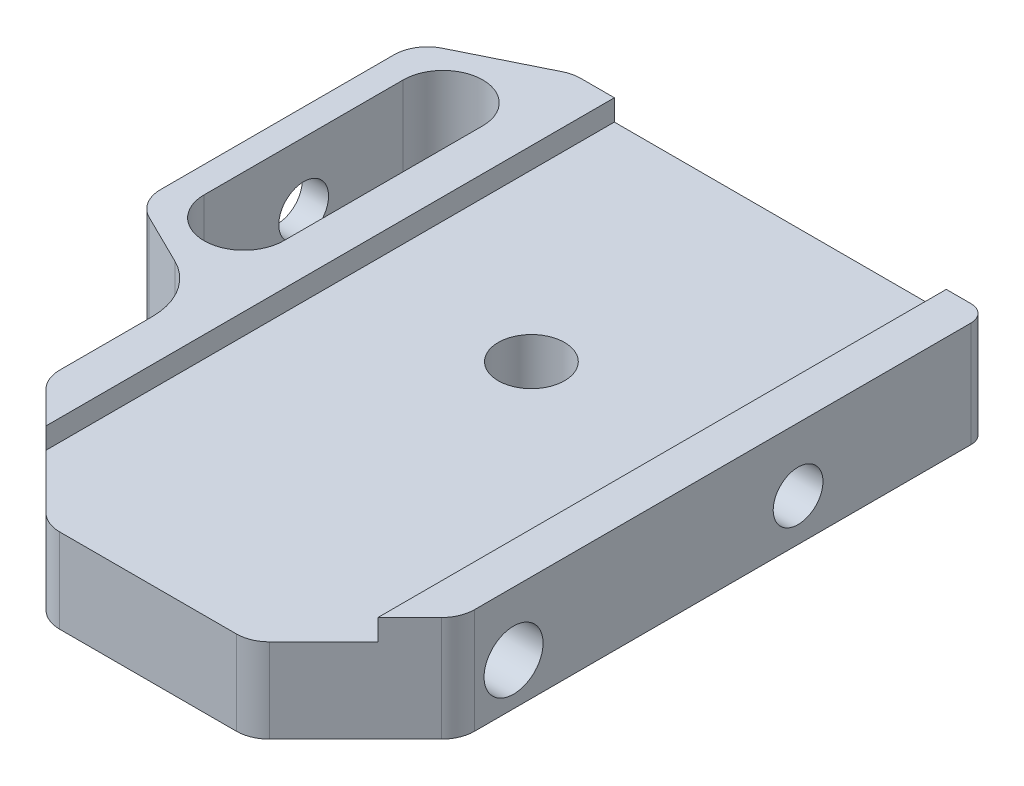
ISO-10303-21;
HEADER;
FILE_DESCRIPTION(('STEP AP214'),'2;1');
FILE_NAME('part.step','',(''),(''),'','','');
FILE_SCHEMA(('AUTOMOTIVE_DESIGN { 1 0 10303 214 1 1 1 1 }'));
ENDSEC;
DATA;
#1=APPLICATION_CONTEXT('core data for automotive mechanical design processes');
#2=APPLICATION_PROTOCOL_DEFINITION('international standard','automotive_design',2000,#1);
#3=PRODUCT_CONTEXT('',#1,'mechanical');
#4=PRODUCT('Part','Part','',(#3));
#5=PRODUCT_RELATED_PRODUCT_CATEGORY('part','',(#4));
#6=PRODUCT_DEFINITION_FORMATION('','',#4);
#7=PRODUCT_DEFINITION_CONTEXT('part definition',#1,'design');
#8=PRODUCT_DEFINITION('design','',#6,#7);
#9=PRODUCT_DEFINITION_SHAPE('','',#8);
#10=(LENGTH_UNIT() NAMED_UNIT(*) SI_UNIT(.MILLI.,.METRE.));
#11=(NAMED_UNIT(*) PLANE_ANGLE_UNIT() SI_UNIT($,.RADIAN.));
#12=(NAMED_UNIT(*) SI_UNIT($,.STERADIAN.) SOLID_ANGLE_UNIT());
#13=UNCERTAINTY_MEASURE_WITH_UNIT(LENGTH_MEASURE(1.E-05),#10,'distance_accuracy_value','');
#14=(GEOMETRIC_REPRESENTATION_CONTEXT(3) GLOBAL_UNCERTAINTY_ASSIGNED_CONTEXT((#13)) GLOBAL_UNIT_ASSIGNED_CONTEXT((#10,
#11,#12)) REPRESENTATION_CONTEXT('',''));
#15=CARTESIAN_POINT('',(0.,0.,0.));
#16=DIRECTION('',(0.,0.,1.));
#17=DIRECTION('',(1.,0.,0.));
#18=AXIS2_PLACEMENT_3D('',#15,#16,#17);
#19=CARTESIAN_POINT('',(22.5,0.,38.1));
#20=DIRECTION('',(1.,0.,0.));
#21=DIRECTION('',(0.,0.,-1.));
#22=AXIS2_PLACEMENT_3D('',#19,#20,#21);
#23=PLANE('',#22);
#24=DIRECTION('',(0.,1.,0.));
#25=VECTOR('',#24,1.);
#26=CARTESIAN_POINT('',(22.5,0.,34.25));
#27=LINE('',#26,#25);
#28=CARTESIAN_POINT('',(22.5,6.35,34.25));
#29=VERTEX_POINT('',#28);
#30=CARTESIAN_POINT('',(22.5,5.08,34.25));
#31=VERTEX_POINT('',#30);
#32=EDGE_CURVE('E398',#29,#31,#27,.F.);
#33=ORIENTED_EDGE('',*,*,#32,.F.);
#34=DIRECTION('',(0.,0.,1.));
#35=VECTOR('',#34,1.);
#36=CARTESIAN_POINT('',(22.5,6.35,38.1));
#37=LINE('',#36,#35);
#38=CARTESIAN_POINT('',(22.5,6.35,0.));
#39=VERTEX_POINT('',#38);
#40=EDGE_CURVE('E288',#39,#29,#37,.T.);
#41=ORIENTED_EDGE('',*,*,#40,.F.);
#42=DIRECTION('',(0.,1.,0.));
#43=VECTOR('',#42,1.);
#44=CARTESIAN_POINT('',(22.5,0.,0.));
#45=LINE('',#44,#43);
#46=CARTESIAN_POINT('',(22.5,5.08,0.));
#47=VERTEX_POINT('',#46);
#48=EDGE_CURVE('E417',#47,#39,#45,.T.);
#49=ORIENTED_EDGE('',*,*,#48,.F.);
#50=DIRECTION('',(0.,0.,1.));
#51=VECTOR('',#50,1.);
#52=CARTESIAN_POINT('',(22.5,5.08,38.1));
#53=LINE('',#52,#51);
#54=EDGE_CURVE('E268',#31,#47,#53,.F.);
#55=ORIENTED_EDGE('',*,*,#54,.F.);
#56=EDGE_LOOP('',(#33,#41,#49,#55));
#57=FACE_BOUND('',#56,.T.);
#58=ADVANCED_FACE('F20',(#57),#23,.F.);
#59=CARTESIAN_POINT('',(2.5,0.,38.1));
#60=DIRECTION('',(1.,0.,0.));
#61=DIRECTION('',(0.,0.,-1.));
#62=AXIS2_PLACEMENT_3D('',#59,#60,#61);
#63=PLANE('',#62);
#64=DIRECTION('',(0.,0.,1.));
#65=VECTOR('',#64,1.);
#66=CARTESIAN_POINT('',(2.5,5.08,38.1));
#67=LINE('',#66,#65);
#68=CARTESIAN_POINT('',(2.5,5.08,0.));
#69=VERTEX_POINT('',#68);
#70=CARTESIAN_POINT('',(2.5,5.08,34.25));
#71=VERTEX_POINT('',#70);
#72=EDGE_CURVE('E263',#69,#71,#67,.T.);
#73=ORIENTED_EDGE('',*,*,#72,.F.);
#74=DIRECTION('',(0.,1.,0.));
#75=VECTOR('',#74,1.);
#76=CARTESIAN_POINT('',(2.5,0.,0.));
#77=LINE('',#76,#75);
#78=CARTESIAN_POINT('',(2.5,6.35,0.));
#79=VERTEX_POINT('',#78);
#80=EDGE_CURVE('E187',#69,#79,#77,.T.);
#81=ORIENTED_EDGE('',*,*,#80,.T.);
#82=DIRECTION('',(0.,0.,1.));
#83=VECTOR('',#82,1.);
#84=CARTESIAN_POINT('',(2.5,6.35,38.1));
#85=LINE('',#84,#83);
#86=CARTESIAN_POINT('',(2.5,6.35,34.25));
#87=VERTEX_POINT('',#86);
#88=EDGE_CURVE('E254',#87,#79,#85,.F.);
#89=ORIENTED_EDGE('',*,*,#88,.F.);
#90=DIRECTION('',(0.,1.,0.));
#91=VECTOR('',#90,1.);
#92=CARTESIAN_POINT('',(2.5,0.,34.25));
#93=LINE('',#92,#91);
#94=EDGE_CURVE('E394',#87,#71,#93,.F.);
#95=ORIENTED_EDGE('',*,*,#94,.T.);
#96=EDGE_LOOP('',(#73,#81,#89,#95));
#97=FACE_BOUND('',#96,.T.);
#98=ADVANCED_FACE('F640',(#97),#63,.T.);
#99=CARTESIAN_POINT('',(2.000000064,0.,30.9215728487441));
#100=DIRECTION('',(0.,-1.,0.));
#101=DIRECTION('',(0.,0.,-1.));
#102=AXIS2_PLACEMENT_3D('',#99,#100,#101);
#103=CYLINDRICAL_SURFACE('',#102,2.000000064);
#104=CARTESIAN_POINT('',(2.000000064,6.35,30.9215728487441));
#105=DIRECTION('',(0.,-1.,0.));
#106=DIRECTION('',(0.,0.,-1.));
#107=AXIS2_PLACEMENT_3D('',#104,#105,#106);
#108=CIRCLE('',#107,2.000000064);
#109=CARTESIAN_POINT('',(0.,6.35,30.9215728487441));
#110=VERTEX_POINT('',#109);
#111=CARTESIAN_POINT('',(0.585786456372072,6.35,32.3357864563721));
#112=VERTEX_POINT('',#111);
#113=EDGE_CURVE('E257',#110,#112,#108,.F.);
#114=ORIENTED_EDGE('',*,*,#113,.F.);
#115=DIRECTION('',(0.,1.,0.));
#116=VECTOR('',#115,1.);
#117=CARTESIAN_POINT('',(0.,0.,30.9215728487441));
#118=LINE('',#117,#116);
#119=CARTESIAN_POINT('',(0.,0.,30.9215728487441));
#120=VERTEX_POINT('',#119);
#121=EDGE_CURVE('E183',#120,#110,#118,.T.);
#122=ORIENTED_EDGE('',*,*,#121,.F.);
#123=CARTESIAN_POINT('',(2.000000064,0.,30.9215728487441));
#124=DIRECTION('',(0.,-1.,0.));
#125=DIRECTION('',(0.,0.,-1.));
#126=AXIS2_PLACEMENT_3D('',#123,#124,#125);
#127=CIRCLE('',#126,2.000000064);
#128=CARTESIAN_POINT('',(0.585786456372071,0.,32.3357864563721));
#129=VERTEX_POINT('',#128);
#130=EDGE_CURVE('E23',#120,#129,#127,.F.);
#131=ORIENTED_EDGE('',*,*,#130,.T.);
#132=DIRECTION('',(0.,1.,0.));
#133=VECTOR('',#132,1.);
#134=CARTESIAN_POINT('',(0.585786456372072,0.,32.3357864563721));
#135=LINE('',#134,#133);
#136=EDGE_CURVE('E182',#129,#112,#135,.T.);
#137=ORIENTED_EDGE('',*,*,#136,.T.);
#138=EDGE_LOOP('',(#114,#122,#131,#137));
#139=FACE_BOUND('',#138,.T.);
#140=ADVANCED_FACE('F181',(#139),#103,.T.);
#141=CARTESIAN_POINT('',(7.17842715125588,0.,36.099999936));
#142=DIRECTION('',(0.,1.,0.));
#143=DIRECTION('',(0.,0.,1.));
#144=AXIS2_PLACEMENT_3D('',#141,#142,#143);
#145=CYLINDRICAL_SURFACE('',#144,2.000000064);
#146=CARTESIAN_POINT('',(7.17842715125588,0.,36.099999936));
#147=DIRECTION('',(0.,1.,0.));
#148=DIRECTION('',(0.,0.,1.));
#149=AXIS2_PLACEMENT_3D('',#146,#147,#148);
#150=CIRCLE('',#149,2.000000064);
#151=CARTESIAN_POINT('',(5.76421354362795,0.,37.5142135436279));
#152=VERTEX_POINT('',#151);
#153=CARTESIAN_POINT('',(7.17842715125588,0.,38.1));
#154=VERTEX_POINT('',#153);
#155=EDGE_CURVE('E186',#152,#154,#150,.T.);
#156=ORIENTED_EDGE('',*,*,#155,.T.);
#157=DIRECTION('',(0.,1.,0.));
#158=VECTOR('',#157,1.);
#159=CARTESIAN_POINT('',(7.17842715125588,0.,38.1));
#160=LINE('',#159,#158);
#161=CARTESIAN_POINT('',(7.17842715125588,5.08,38.1));
#162=VERTEX_POINT('',#161);
#163=EDGE_CURVE('E486',#162,#154,#160,.F.);
#164=ORIENTED_EDGE('',*,*,#163,.F.);
#165=CARTESIAN_POINT('',(7.17842715125588,5.08,36.099999936));
#166=DIRECTION('',(0.,1.,0.));
#167=DIRECTION('',(0.,0.,1.));
#168=AXIS2_PLACEMENT_3D('',#165,#166,#167);
#169=CIRCLE('',#168,2.000000064);
#170=CARTESIAN_POINT('',(5.76421354362795,5.08,37.5142135436279));
#171=VERTEX_POINT('',#170);
#172=EDGE_CURVE('E260',#171,#162,#169,.T.);
#173=ORIENTED_EDGE('',*,*,#172,.F.);
#174=DIRECTION('',(0.,1.,0.));
#175=VECTOR('',#174,1.);
#176=CARTESIAN_POINT('',(5.76421354362795,0.,37.5142135436279));
#177=LINE('',#176,#175);
#178=EDGE_CURVE('E493',#171,#152,#177,.F.);
#179=ORIENTED_EDGE('',*,*,#178,.T.);
#180=EDGE_LOOP('',(#156,#164,#173,#179));
#181=FACE_BOUND('',#180,.T.);
#182=ADVANCED_FACE('F630',(#181),#145,.T.);
#183=CARTESIAN_POINT('',(17.8215728487441,0.,36.099999936));
#184=DIRECTION('',(0.,1.,0.));
#185=DIRECTION('',(0.,0.,1.));
#186=AXIS2_PLACEMENT_3D('',#183,#184,#185);
#187=CYLINDRICAL_SURFACE('',#186,2.000000064);
#188=CARTESIAN_POINT('',(17.8215728487441,5.08,36.099999936));
#189=DIRECTION('',(0.,1.,0.));
#190=DIRECTION('',(0.,0.,1.));
#191=AXIS2_PLACEMENT_3D('',#188,#189,#190);
#192=CIRCLE('',#191,2.000000064);
#193=CARTESIAN_POINT('',(17.8215728487441,5.08,38.1));
#194=VERTEX_POINT('',#193);
#195=CARTESIAN_POINT('',(19.2357864563721,5.08,37.5142135436279));
#196=VERTEX_POINT('',#195);
#197=EDGE_CURVE('E264',#194,#196,#192,.T.);
#198=ORIENTED_EDGE('',*,*,#197,.F.);
#199=DIRECTION('',(0.,1.,0.));
#200=VECTOR('',#199,1.);
#201=CARTESIAN_POINT('',(17.8215728487441,0.,38.1));
#202=LINE('',#201,#200);
#203=CARTESIAN_POINT('',(17.8215728487441,0.,38.1));
#204=VERTEX_POINT('',#203);
#205=EDGE_CURVE('E491',#204,#194,#202,.T.);
#206=ORIENTED_EDGE('',*,*,#205,.F.);
#207=CARTESIAN_POINT('',(17.8215728487441,0.,36.099999936));
#208=DIRECTION('',(0.,1.,0.));
#209=DIRECTION('',(0.,0.,1.));
#210=AXIS2_PLACEMENT_3D('',#207,#208,#209);
#211=CIRCLE('',#210,2.000000064);
#212=CARTESIAN_POINT('',(19.2357864563721,0.,37.5142135436279));
#213=VERTEX_POINT('',#212);
#214=EDGE_CURVE('E277',#204,#213,#211,.T.);
#215=ORIENTED_EDGE('',*,*,#214,.T.);
#216=DIRECTION('',(0.,1.,0.));
#217=VECTOR('',#216,1.);
#218=CARTESIAN_POINT('',(19.2357864563721,0.,37.5142135436279));
#219=LINE('',#218,#217);
#220=EDGE_CURVE('E478',#196,#213,#219,.F.);
#221=ORIENTED_EDGE('',*,*,#220,.F.);
#222=EDGE_LOOP('',(#198,#206,#215,#221));
#223=FACE_BOUND('',#222,.T.);
#224=ADVANCED_FACE('F625',(#223),#187,.T.);
#225=CARTESIAN_POINT('',(35.56,2.54,28.575));
#226=DIRECTION('',(-1.,0.,0.));
#227=DIRECTION('',(0.,0.,1.));
#228=AXIS2_PLACEMENT_3D('',#225,#226,#227);
#229=CYLINDRICAL_SURFACE('',#228,1.778);
#230=CARTESIAN_POINT('',(25.,2.54,28.575));
#231=DIRECTION('',(-1.,0.,0.));
#232=DIRECTION('',(0.,0.,1.));
#233=AXIS2_PLACEMENT_3D('',#230,#231,#232);
#234=CIRCLE('',#233,1.778);
#235=CARTESIAN_POINT('',(25.,2.54,30.353));
#236=VERTEX_POINT('',#235);
#237=EDGE_CURVE('E321',#236,#236,#234,.F.);
#238=ORIENTED_EDGE('',*,*,#237,.T.);
#239=EDGE_LOOP('',(#238));
#240=FACE_BOUND('',#239,.T.);
#241=CARTESIAN_POINT('',(0.,2.54,28.575));
#242=DIRECTION('',(-1.,0.,0.));
#243=DIRECTION('',(0.,0.,1.));
#244=AXIS2_PLACEMENT_3D('',#241,#242,#243);
#245=CIRCLE('',#244,1.778);
#246=CARTESIAN_POINT('',(0.,2.54,30.353));
#247=VERTEX_POINT('',#246);
#248=EDGE_CURVE('E326',#247,#247,#245,.F.);
#249=ORIENTED_EDGE('',*,*,#248,.F.);
#250=EDGE_LOOP('',(#249));
#251=FACE_BOUND('',#250,.T.);
#252=ADVANCED_FACE('F638',(#240,#251),#229,.F.);
#253=CARTESIAN_POINT('',(22.999999936,0.,30.9215728487441));
#254=DIRECTION('',(0.,1.,0.));
#255=DIRECTION('',(0.,0.,1.));
#256=AXIS2_PLACEMENT_3D('',#253,#254,#255);
#257=CYLINDRICAL_SURFACE('',#256,2.000000064);
#258=CARTESIAN_POINT('',(22.999999936,0.,30.9215728487441));
#259=DIRECTION('',(0.,1.,0.));
#260=DIRECTION('',(0.,0.,1.));
#261=AXIS2_PLACEMENT_3D('',#258,#259,#260);
#262=CIRCLE('',#261,2.000000064);
#263=CARTESIAN_POINT('',(24.4142135436279,0.,32.335786456372));
#264=VERTEX_POINT('',#263);
#265=CARTESIAN_POINT('',(25.,0.,30.9215728487441));
#266=VERTEX_POINT('',#265);
#267=EDGE_CURVE('E279',#264,#266,#262,.T.);
#268=ORIENTED_EDGE('',*,*,#267,.T.);
#269=DIRECTION('',(0.,1.,0.));
#270=VECTOR('',#269,1.);
#271=CARTESIAN_POINT('',(25.,0.,30.9215728487441));
#272=LINE('',#271,#270);
#273=CARTESIAN_POINT('',(25.,6.35,30.9215728487441));
#274=VERTEX_POINT('',#273);
#275=EDGE_CURVE('E320',#266,#274,#272,.T.);
#276=ORIENTED_EDGE('',*,*,#275,.T.);
#277=CARTESIAN_POINT('',(22.999999936,6.35,30.9215728487441));
#278=DIRECTION('',(0.,1.,0.));
#279=DIRECTION('',(0.,0.,1.));
#280=AXIS2_PLACEMENT_3D('',#277,#278,#279);
#281=CIRCLE('',#280,2.000000064);
#282=CARTESIAN_POINT('',(24.4142135436279,6.35,32.335786456372));
#283=VERTEX_POINT('',#282);
#284=EDGE_CURVE('E284',#283,#274,#281,.T.);
#285=ORIENTED_EDGE('',*,*,#284,.F.);
#286=DIRECTION('',(0.,1.,0.));
#287=VECTOR('',#286,1.);
#288=CARTESIAN_POINT('',(24.4142135436279,0.,32.335786456372));
#289=LINE('',#288,#287);
#290=EDGE_CURVE('E482',#264,#283,#289,.T.);
#291=ORIENTED_EDGE('',*,*,#290,.F.);
#292=EDGE_LOOP('',(#268,#276,#285,#291));
#293=FACE_BOUND('',#292,.T.);
#294=ADVANCED_FACE('F561',(#293),#257,.T.);
#295=CARTESIAN_POINT('',(0.,6.35,38.1));
#296=DIRECTION('',(0.,1.,0.));
#297=DIRECTION('',(0.,0.,1.));
#298=AXIS2_PLACEMENT_3D('',#295,#296,#297);
#299=PLANE('',#298);
#300=DIRECTION('',(0.707106781186546,0.,-0.707106781186549));
#301=VECTOR('',#300,1.);
#302=CARTESIAN_POINT('',(18.65,6.35,38.1));
#303=LINE('',#302,#301);
#304=EDGE_CURVE('E325',#283,#29,#303,.F.);
#305=ORIENTED_EDGE('',*,*,#304,.F.);
#306=ORIENTED_EDGE('',*,*,#284,.T.);
#307=DIRECTION('',(0.,0.,1.));
#308=VECTOR('',#307,1.);
#309=CARTESIAN_POINT('',(25.,6.35,38.1));
#310=LINE('',#309,#308);
#311=CARTESIAN_POINT('',(25.,6.35,1.00000003200001));
#312=VERTEX_POINT('',#311);
#313=EDGE_CURVE('E474',#274,#312,#310,.F.);
#314=ORIENTED_EDGE('',*,*,#313,.T.);
#315=CARTESIAN_POINT('',(23.999999968,6.35,1.000000032));
#316=DIRECTION('',(0.,1.,0.));
#317=DIRECTION('',(0.,0.,1.));
#318=AXIS2_PLACEMENT_3D('',#315,#316,#317);
#319=CIRCLE('',#318,1.000000032);
#320=CARTESIAN_POINT('',(23.999999968,6.35,0.));
#321=VERTEX_POINT('',#320);
#322=EDGE_CURVE('E269',#321,#312,#319,.F.);
#323=ORIENTED_EDGE('',*,*,#322,.F.);
#324=DIRECTION('',(1.,0.,0.));
#325=VECTOR('',#324,1.);
#326=CARTESIAN_POINT('',(0.,6.35,0.));
#327=LINE('',#326,#325);
#328=EDGE_CURVE('E283',#321,#39,#327,.F.);
#329=ORIENTED_EDGE('',*,*,#328,.T.);
#330=ORIENTED_EDGE('',*,*,#40,.T.);
#331=EDGE_LOOP('',(#305,#306,#314,#323,#329,#330));
#332=FACE_BOUND('',#331,.T.);
#333=ADVANCED_FACE('F567',(#332),#299,.T.);
#334=CARTESIAN_POINT('',(0.466313361609076,0.,2.000000064));
#335=DIRECTION('',(0.,1.,0.));
#336=DIRECTION('',(0.,0.,1.));
#337=AXIS2_PLACEMENT_3D('',#334,#335,#336);
#338=CYLINDRICAL_SURFACE('',#337,2.000000064);
#339=CARTESIAN_POINT('',(0.466313361609076,6.34999999999999,2.000000064));
#340=DIRECTION('',(0.,1.,0.));
#341=DIRECTION('',(0.,0.,1.));
#342=AXIS2_PLACEMENT_3D('',#339,#340,#341);
#343=CIRCLE('',#342,2.000000064);
#344=CARTESIAN_POINT('',(0.466313361609076,6.35,0.));
#345=VERTEX_POINT('',#344);
#346=CARTESIAN_POINT('',(-0.418227899226016,6.34999999999999,0.206236697811396));
#347=VERTEX_POINT('',#346);
#348=EDGE_CURVE('E248',#345,#347,#343,.T.);
#349=ORIENTED_EDGE('',*,*,#348,.F.);
#350=DIRECTION('',(0.,1.,0.));
#351=VECTOR('',#350,1.);
#352=CARTESIAN_POINT('',(0.466313361609076,0.,0.));
#353=LINE('',#352,#351);
#354=CARTESIAN_POINT('',(0.466313361609076,0.,0.));
#355=VERTEX_POINT('',#354);
#356=EDGE_CURVE('E467',#345,#355,#353,.F.);
#357=ORIENTED_EDGE('',*,*,#356,.T.);
#358=CARTESIAN_POINT('',(0.466313361609076,0.,2.000000064));
#359=DIRECTION('',(0.,1.,0.));
#360=DIRECTION('',(0.,0.,1.));
#361=AXIS2_PLACEMENT_3D('',#358,#359,#360);
#362=CIRCLE('',#361,2.000000064);
#363=CARTESIAN_POINT('',(-0.418227899226016,0.,0.206236697811397));
#364=VERTEX_POINT('',#363);
#365=EDGE_CURVE('E287',#355,#364,#362,.T.);
#366=ORIENTED_EDGE('',*,*,#365,.T.);
#367=DIRECTION('',(0.,1.,0.));
#368=VECTOR('',#367,1.);
#369=CARTESIAN_POINT('',(-0.418227899226016,30.0839409193353,0.206236697811396));
#370=LINE('',#369,#368);
#371=EDGE_CURVE('E253',#364,#347,#370,.T.);
#372=ORIENTED_EDGE('',*,*,#371,.T.);
#373=EDGE_LOOP('',(#349,#357,#366,#372));
#374=FACE_BOUND('',#373,.T.);
#375=ADVANCED_FACE('F534',(#374),#338,.T.);
#376=CARTESIAN_POINT('',(23.999999968,0.,1.000000032));
#377=DIRECTION('',(0.,1.,0.));
#378=DIRECTION('',(0.,0.,1.));
#379=AXIS2_PLACEMENT_3D('',#376,#377,#378);
#380=CYLINDRICAL_SURFACE('',#379,1.000000032);
#381=ORIENTED_EDGE('',*,*,#322,.T.);
#382=DIRECTION('',(0.,1.,0.));
#383=VECTOR('',#382,1.);
#384=CARTESIAN_POINT('',(25.,0.,1.00000003200001));
#385=LINE('',#384,#383);
#386=CARTESIAN_POINT('',(25.,0.,1.00000003200001));
#387=VERTEX_POINT('',#386);
#388=EDGE_CURVE('E411',#312,#387,#385,.F.);
#389=ORIENTED_EDGE('',*,*,#388,.T.);
#390=CARTESIAN_POINT('',(23.999999968,0.,1.000000032));
#391=DIRECTION('',(0.,1.,0.));
#392=DIRECTION('',(0.,0.,1.));
#393=AXIS2_PLACEMENT_3D('',#390,#391,#392);
#394=CIRCLE('',#393,1.000000032);
#395=CARTESIAN_POINT('',(23.999999968,0.,0.));
#396=VERTEX_POINT('',#395);
#397=EDGE_CURVE('E290',#387,#396,#394,.T.);
#398=ORIENTED_EDGE('',*,*,#397,.T.);
#399=DIRECTION('',(0.,1.,0.));
#400=VECTOR('',#399,1.);
#401=CARTESIAN_POINT('',(23.999999968,0.,0.));
#402=LINE('',#401,#400);
#403=EDGE_CURVE('E315',#396,#321,#402,.T.);
#404=ORIENTED_EDGE('',*,*,#403,.T.);
#405=EDGE_LOOP('',(#381,#389,#398,#404));
#406=FACE_BOUND('',#405,.T.);
#407=ADVANCED_FACE('F706',(#406),#380,.T.);
#408=CARTESIAN_POINT('',(0.,5.08,38.1));
#409=DIRECTION('',(0.,1.,0.));
#410=DIRECTION('',(0.,0.,1.));
#411=AXIS2_PLACEMENT_3D('',#408,#409,#410);
#412=PLANE('',#411);
#413=DIRECTION('',(-0.707106781186549,0.,-0.707106781186547));
#414=VECTOR('',#413,1.);
#415=CARTESIAN_POINT('',(0.,5.08,31.75));
#416=LINE('',#415,#414);
#417=EDGE_CURVE('E380',#71,#171,#416,.F.);
#418=ORIENTED_EDGE('',*,*,#417,.T.);
#419=ORIENTED_EDGE('',*,*,#172,.T.);
#420=DIRECTION('',(1.,0.,0.));
#421=VECTOR('',#420,1.);
#422=CARTESIAN_POINT('',(0.,5.08,38.1));
#423=LINE('',#422,#421);
#424=EDGE_CURVE('E490',#194,#162,#423,.F.);
#425=ORIENTED_EDGE('',*,*,#424,.F.);
#426=ORIENTED_EDGE('',*,*,#197,.T.);
#427=DIRECTION('',(0.707106781186546,0.,-0.707106781186549));
#428=VECTOR('',#427,1.);
#429=CARTESIAN_POINT('',(18.65,5.08,38.1));
#430=LINE('',#429,#428);
#431=EDGE_CURVE('E483',#31,#196,#430,.F.);
#432=ORIENTED_EDGE('',*,*,#431,.F.);
#433=ORIENTED_EDGE('',*,*,#54,.T.);
#434=DIRECTION('',(1.,0.,0.));
#435=VECTOR('',#434,1.);
#436=CARTESIAN_POINT('',(0.,5.08,0.));
#437=LINE('',#436,#435);
#438=EDGE_CURVE('E406',#47,#69,#437,.F.);
#439=ORIENTED_EDGE('',*,*,#438,.T.);
#440=ORIENTED_EDGE('',*,*,#72,.T.);
#441=EDGE_LOOP('',(#418,#419,#425,#426,#432,#433,#439,#440));
#442=FACE_BOUND('',#441,.T.);
#443=CARTESIAN_POINT('',(12.5,5.08,15.));
#444=DIRECTION('',(0.,1.,0.));
#445=DIRECTION('',(0.,0.,1.));
#446=AXIS2_PLACEMENT_3D('',#443,#444,#445);
#447=CIRCLE('',#446,2.);
#448=CARTESIAN_POINT('',(12.5,5.08,17.));
#449=VERTEX_POINT('',#448);
#450=EDGE_CURVE('E311',#449,#449,#447,.F.);
#451=ORIENTED_EDGE('',*,*,#450,.T.);
#452=EDGE_LOOP('',(#451));
#453=FACE_BOUND('',#452,.T.);
#454=ADVANCED_FACE('F600',(#442,#453),#412,.T.);
#455=CARTESIAN_POINT('',(29.17875,2.54,11.43));
#456=DIRECTION('',(-1.,0.,0.));
#457=DIRECTION('',(0.,0.,1.));
#458=AXIS2_PLACEMENT_3D('',#455,#456,#457);
#459=CYLINDRICAL_SURFACE('',#458,1.5);
#460=CARTESIAN_POINT('',(-4.79375,2.54,11.43));
#461=DIRECTION('',(-1.,0.,0.));
#462=DIRECTION('',(0.,0.,1.));
#463=AXIS2_PLACEMENT_3D('',#460,#461,#462);
#464=CIRCLE('',#463,1.5);
#465=CARTESIAN_POINT('',(-4.79375,2.54,12.93));
#466=VERTEX_POINT('',#465);
#467=EDGE_CURVE('E298',#466,#466,#464,.T.);
#468=ORIENTED_EDGE('',*,*,#467,.F.);
#469=EDGE_LOOP('',(#468));
#470=FACE_BOUND('',#469,.T.);
#471=CARTESIAN_POINT('',(-6.38125,2.54,11.43));
#472=DIRECTION('',(-1.,0.,0.));
#473=DIRECTION('',(0.,0.,1.));
#474=AXIS2_PLACEMENT_3D('',#471,#472,#473);
#475=CIRCLE('',#474,1.5);
#476=CARTESIAN_POINT('',(-6.38125,2.54,12.93));
#477=VERTEX_POINT('',#476);
#478=EDGE_CURVE('E339',#477,#477,#475,.T.);
#479=ORIENTED_EDGE('',*,*,#478,.T.);
#480=EDGE_LOOP('',(#479));
#481=FACE_BOUND('',#480,.T.);
#482=ADVANCED_FACE('F699',(#470,#481),#459,.F.);
#483=CARTESIAN_POINT('',(29.17875,2.54,11.43));
#484=DIRECTION('',(-1.,0.,0.));
#485=DIRECTION('',(0.,0.,1.));
#486=AXIS2_PLACEMENT_3D('',#483,#484,#485);
#487=CYLINDRICAL_SURFACE('',#486,1.5);
#488=CARTESIAN_POINT('',(0.,2.54,11.43));
#489=DIRECTION('',(-1.,0.,0.));
#490=DIRECTION('',(0.,0.,1.));
#491=AXIS2_PLACEMENT_3D('',#488,#489,#490);
#492=CIRCLE('',#491,1.5);
#493=CARTESIAN_POINT('',(0.,2.54,12.93));
#494=VERTEX_POINT('',#493);
#495=EDGE_CURVE('E240',#494,#494,#492,.F.);
#496=ORIENTED_EDGE('',*,*,#495,.F.);
#497=EDGE_LOOP('',(#496));
#498=FACE_BOUND('',#497,.T.);
#499=CARTESIAN_POINT('',(25.,2.54,11.43));
#500=DIRECTION('',(-1.,0.,0.));
#501=DIRECTION('',(0.,0.,1.));
#502=AXIS2_PLACEMENT_3D('',#499,#500,#501);
#503=CIRCLE('',#502,1.5);
#504=CARTESIAN_POINT('',(25.,2.54,12.93));
#505=VERTEX_POINT('',#504);
#506=EDGE_CURVE('E316',#505,#505,#503,.F.);
#507=ORIENTED_EDGE('',*,*,#506,.T.);
#508=EDGE_LOOP('',(#507));
#509=FACE_BOUND('',#508,.T.);
#510=ADVANCED_FACE('F696',(#498,#509),#487,.F.);
#511=CARTESIAN_POINT('',(0.,6.35,38.1));
#512=DIRECTION('',(0.,1.,0.));
#513=DIRECTION('',(0.,0.,1.));
#514=AXIS2_PLACEMENT_3D('',#511,#512,#513);
#515=PLANE('',#514);
#516=DIRECTION('',(-0.896881654394089,0.,-0.442270616264887));
#517=VECTOR('',#516,1.);
#518=CARTESIAN_POINT('',(-9.06774822984675,6.34999999999998,18.3885086074612));
#519=LINE('',#518,#517);
#520=CARTESIAN_POINT('',(-5.26579119683509,6.34999999999999,20.2633310790376));
#521=VERTEX_POINT('',#520);
#522=CARTESIAN_POINT('',(-2.23091760632981,6.34999999999999,21.7598890770553));
#523=VERTEX_POINT('',#522);
#524=EDGE_CURVE('E356',#521,#523,#519,.F.);
#525=ORIENTED_EDGE('',*,*,#524,.T.);
#526=CARTESIAN_POINT('',(-4.000000128,6.35,25.3474158094325));
#527=DIRECTION('',(0.,-1.,0.));
#528=DIRECTION('',(0.,0.,-1.));
#529=AXIS2_PLACEMENT_3D('',#526,#527,#528);
#530=CIRCLE('',#529,4.000000128);
#531=CARTESIAN_POINT('',(0.,6.35,25.3474158094325));
#532=VERTEX_POINT('',#531);
#533=EDGE_CURVE('E330',#523,#532,#530,.T.);
#534=ORIENTED_EDGE('',*,*,#533,.T.);
#535=DIRECTION('',(0.,0.,1.));
#536=VECTOR('',#535,1.);
#537=CARTESIAN_POINT('',(0.,6.35,38.1));
#538=LINE('',#537,#536);
#539=EDGE_CURVE('E383',#110,#532,#538,.F.);
#540=ORIENTED_EDGE('',*,*,#539,.F.);
#541=ORIENTED_EDGE('',*,*,#113,.T.);
#542=DIRECTION('',(-0.707106781186549,0.,-0.707106781186547));
#543=VECTOR('',#542,1.);
#544=CARTESIAN_POINT('',(0.,6.35,31.75));
#545=LINE('',#544,#543);
#546=EDGE_CURVE('E196',#112,#87,#545,.F.);
#547=ORIENTED_EDGE('',*,*,#546,.T.);
#548=ORIENTED_EDGE('',*,*,#88,.T.);
#549=DIRECTION('',(1.,0.,0.));
#550=VECTOR('',#549,1.);
#551=CARTESIAN_POINT('',(0.,6.35,0.));
#552=LINE('',#551,#550);
#553=EDGE_CURVE('E410',#79,#345,#552,.F.);
#554=ORIENTED_EDGE('',*,*,#553,.T.);
#555=ORIENTED_EDGE('',*,*,#348,.T.);
#556=DIRECTION('',(0.896881654394089,0.,-0.442270616264886));
#557=VECTOR('',#556,1.);
#558=CARTESIAN_POINT('',(0.,6.34999999999999,0.));
#559=LINE('',#558,#557);
#560=CARTESIAN_POINT('',(-5.26579119683509,6.35,2.5966689209624));
#561=VERTEX_POINT('',#560);
#562=EDGE_CURVE('E369',#347,#561,#559,.F.);
#563=ORIENTED_EDGE('',*,*,#562,.T.);
#564=CARTESIAN_POINT('',(-4.381249936,6.35,4.390432287151));
#565=DIRECTION('',(0.,-1.,0.));
#566=DIRECTION('',(0.,0.,-1.));
#567=AXIS2_PLACEMENT_3D('',#564,#565,#566);
#568=CIRCLE('',#567,2.000000064);
#569=CARTESIAN_POINT('',(-6.38125,6.35,4.390432287151));
#570=VERTEX_POINT('',#569);
#571=EDGE_CURVE('E255',#570,#561,#568,.T.);
#572=ORIENTED_EDGE('',*,*,#571,.F.);
#573=DIRECTION('',(0.,0.,-1.));
#574=VECTOR('',#573,1.);
#575=CARTESIAN_POINT('',(-6.38125,6.35,0.));
#576=LINE('',#575,#574);
#577=CARTESIAN_POINT('',(-6.38125,6.35,18.469567712849));
#578=VERTEX_POINT('',#577);
#579=EDGE_CURVE('E338',#570,#578,#576,.F.);
#580=ORIENTED_EDGE('',*,*,#579,.T.);
#581=CARTESIAN_POINT('',(-4.381249936,6.35,18.469567712849));
#582=DIRECTION('',(0.,-1.,0.));
#583=DIRECTION('',(0.,0.,-1.));
#584=AXIS2_PLACEMENT_3D('',#581,#582,#583);
#585=CIRCLE('',#584,2.000000064);
#586=EDGE_CURVE('E335',#521,#578,#585,.T.);
#587=ORIENTED_EDGE('',*,*,#586,.F.);
#588=EDGE_LOOP('',(#525,#534,#540,#541,#547,#548,#554,#555,#563,#572,#580,#587));
#589=FACE_BOUND('',#588,.T.);
#590=DIRECTION('',(0.,0.,-1.));
#591=VECTOR('',#590,1.);
#592=CARTESIAN_POINT('',(-4.79375,6.35,0.));
#593=LINE('',#592,#591);
#594=CARTESIAN_POINT('',(-4.79375,6.35,5.43));
#595=VERTEX_POINT('',#594);
#596=CARTESIAN_POINT('',(-4.79375,6.35,17.43));
#597=VERTEX_POINT('',#596);
#598=EDGE_CURVE('E303',#595,#597,#593,.F.);
#599=ORIENTED_EDGE('',*,*,#598,.F.);
#600=CARTESIAN_POINT('',(-2.396875,6.35,5.43));
#601=DIRECTION('',(0.,-1.,0.));
#602=DIRECTION('',(0.,0.,-1.));
#603=AXIS2_PLACEMENT_3D('',#600,#601,#602);
#604=CIRCLE('',#603,2.396875);
#605=CARTESIAN_POINT('',(0.,6.35,5.43));
#606=VERTEX_POINT('',#605);
#607=EDGE_CURVE('E305',#595,#606,#604,.T.);
#608=ORIENTED_EDGE('',*,*,#607,.T.);
#609=DIRECTION('',(0.,0.,1.));
#610=VECTOR('',#609,1.);
#611=CARTESIAN_POINT('',(0.,6.35,38.1));
#612=LINE('',#611,#610);
#613=CARTESIAN_POINT('',(0.,6.35,17.43));
#614=VERTEX_POINT('',#613);
#615=EDGE_CURVE('E234',#614,#606,#612,.F.);
#616=ORIENTED_EDGE('',*,*,#615,.F.);
#617=CARTESIAN_POINT('',(-2.396875,6.35,17.43));
#618=DIRECTION('',(0.,-1.,0.));
#619=DIRECTION('',(0.,0.,-1.));
#620=AXIS2_PLACEMENT_3D('',#617,#618,#619);
#621=CIRCLE('',#620,2.396875);
#622=EDGE_CURVE('E304',#614,#597,#621,.T.);
#623=ORIENTED_EDGE('',*,*,#622,.T.);
#624=EDGE_LOOP('',(#599,#608,#616,#623));
#625=FACE_BOUND('',#624,.T.);
#626=ADVANCED_FACE('F504',(#589,#625),#515,.T.);
#627=CARTESIAN_POINT('',(0.,30.0839409193353,0.));
#628=DIRECTION('',(0.442270616264886,0.,0.896881654394089));
#629=DIRECTION('',(0.896881654394089,0.,-0.442270616264886));
#630=AXIS2_PLACEMENT_3D('',#627,#628,#629);
#631=PLANE('',#630);
#632=ORIENTED_EDGE('',*,*,#371,.F.);
#633=DIRECTION('',(-0.896881654394089,0.,0.442270616264886));
#634=VECTOR('',#633,1.);
#635=CARTESIAN_POINT('',(-0.418227899226016,0.,0.206236697811397));
#636=LINE('',#635,#634);
#637=CARTESIAN_POINT('',(-5.26579119683509,0.,2.5966689209624));
#638=VERTEX_POINT('',#637);
#639=EDGE_CURVE('E227',#364,#638,#636,.T.);
#640=ORIENTED_EDGE('',*,*,#639,.T.);
#641=DIRECTION('',(0.,-1.,0.));
#642=VECTOR('',#641,1.);
#643=CARTESIAN_POINT('',(-5.26579119683509,30.0839409193353,2.5966689209624));
#644=LINE('',#643,#642);
#645=EDGE_CURVE('E344',#561,#638,#644,.T.);
#646=ORIENTED_EDGE('',*,*,#645,.F.);
#647=ORIENTED_EDGE('',*,*,#562,.F.);
#648=EDGE_LOOP('',(#632,#640,#646,#647));
#649=FACE_BOUND('',#648,.T.);
#650=ADVANCED_FACE('F531',(#649),#631,.F.);
#651=CARTESIAN_POINT('',(-4.381249936,30.0839409193353,4.390432287151));
#652=DIRECTION('',(0.,-1.,0.));
#653=DIRECTION('',(0.,0.,-1.));
#654=AXIS2_PLACEMENT_3D('',#651,#652,#653);
#655=CYLINDRICAL_SURFACE('',#654,2.000000064);
#656=CARTESIAN_POINT('',(-4.381249936,0.,4.390432287151));
#657=DIRECTION('',(0.,-1.,0.));
#658=DIRECTION('',(0.,0.,-1.));
#659=AXIS2_PLACEMENT_3D('',#656,#657,#658);
#660=CIRCLE('',#659,2.000000064);
#661=CARTESIAN_POINT('',(-6.38125,0.,4.390432287151));
#662=VERTEX_POINT('',#661);
#663=EDGE_CURVE('E226',#638,#662,#660,.F.);
#664=ORIENTED_EDGE('',*,*,#663,.T.);
#665=DIRECTION('',(0.,1.,0.));
#666=VECTOR('',#665,1.);
#667=CARTESIAN_POINT('',(-6.38125,30.0839409193353,4.390432287151));
#668=LINE('',#667,#666);
#669=EDGE_CURVE('E343',#662,#570,#668,.T.);
#670=ORIENTED_EDGE('',*,*,#669,.T.);
#671=ORIENTED_EDGE('',*,*,#571,.T.);
#672=ORIENTED_EDGE('',*,*,#645,.T.);
#673=EDGE_LOOP('',(#664,#670,#671,#672));
#674=FACE_BOUND('',#673,.T.);
#675=ADVANCED_FACE('F526',(#674),#655,.T.);
#676=CARTESIAN_POINT('',(-6.38125,30.0839409193353,0.));
#677=DIRECTION('',(1.,0.,0.));
#678=DIRECTION('',(0.,0.,-1.));
#679=AXIS2_PLACEMENT_3D('',#676,#677,#678);
#680=PLANE('',#679);
#681=ORIENTED_EDGE('',*,*,#669,.F.);
#682=DIRECTION('',(0.,0.,1.));
#683=VECTOR('',#682,1.);
#684=CARTESIAN_POINT('',(-6.38125,0.,38.1));
#685=LINE('',#684,#683);
#686=CARTESIAN_POINT('',(-6.38125,0.,18.469567712849));
#687=VERTEX_POINT('',#686);
#688=EDGE_CURVE('E222',#662,#687,#685,.T.);
#689=ORIENTED_EDGE('',*,*,#688,.T.);
#690=DIRECTION('',(0.,-1.,0.));
#691=VECTOR('',#690,1.);
#692=CARTESIAN_POINT('',(-6.38125,30.0839409193353,18.469567712849));
#693=LINE('',#692,#691);
#694=EDGE_CURVE('E337',#578,#687,#693,.T.);
#695=ORIENTED_EDGE('',*,*,#694,.F.);
#696=ORIENTED_EDGE('',*,*,#579,.F.);
#697=EDGE_LOOP('',(#681,#689,#695,#696));
#698=FACE_BOUND('',#697,.T.);
#699=ORIENTED_EDGE('',*,*,#478,.F.);
#700=EDGE_LOOP('',(#699));
#701=FACE_BOUND('',#700,.T.);
#702=ADVANCED_FACE('F522',(#698,#701),#680,.F.);
#703=CARTESIAN_POINT('',(-4.381249936,30.0839409193353,18.469567712849));
#704=DIRECTION('',(0.,-1.,0.));
#705=DIRECTION('',(0.,0.,-1.));
#706=AXIS2_PLACEMENT_3D('',#703,#704,#705);
#707=CYLINDRICAL_SURFACE('',#706,2.000000064);
#708=CARTESIAN_POINT('',(-4.381249936,0.,18.469567712849));
#709=DIRECTION('',(0.,-1.,0.));
#710=DIRECTION('',(0.,0.,-1.));
#711=AXIS2_PLACEMENT_3D('',#708,#709,#710);
#712=CIRCLE('',#711,2.000000064);
#713=CARTESIAN_POINT('',(-5.26579119683509,0.,20.2633310790376));
#714=VERTEX_POINT('',#713);
#715=EDGE_CURVE('E221',#687,#714,#712,.F.);
#716=ORIENTED_EDGE('',*,*,#715,.T.);
#717=DIRECTION('',(0.,1.,0.));
#718=VECTOR('',#717,1.);
#719=CARTESIAN_POINT('',(-5.26579119683509,30.0839409193353,20.2633310790376));
#720=LINE('',#719,#718);
#721=EDGE_CURVE('E350',#714,#521,#720,.T.);
#722=ORIENTED_EDGE('',*,*,#721,.T.);
#723=ORIENTED_EDGE('',*,*,#586,.T.);
#724=ORIENTED_EDGE('',*,*,#694,.T.);
#725=EDGE_LOOP('',(#716,#722,#723,#724));
#726=FACE_BOUND('',#725,.T.);
#727=ADVANCED_FACE('F517',(#726),#707,.T.);
#728=CARTESIAN_POINT('',(-9.06774822984675,30.0839409193353,18.3885086074612));
#729=DIRECTION('',(0.442270616264887,0.,-0.896881654394089));
#730=DIRECTION('',(-0.896881654394089,0.,-0.442270616264887));
#731=AXIS2_PLACEMENT_3D('',#728,#729,#730);
#732=PLANE('',#731);
#733=ORIENTED_EDGE('',*,*,#721,.F.);
#734=DIRECTION('',(0.896881654394089,0.,0.442270616264886));
#735=VECTOR('',#734,1.);
#736=CARTESIAN_POINT('',(-5.26579119683509,0.,20.2633310790376));
#737=LINE('',#736,#735);
#738=CARTESIAN_POINT('',(-2.23091760632981,0.,21.7598890770553));
#739=VERTEX_POINT('',#738);
#740=EDGE_CURVE('E217',#714,#739,#737,.T.);
#741=ORIENTED_EDGE('',*,*,#740,.T.);
#742=DIRECTION('',(0.,-1.,0.));
#743=VECTOR('',#742,1.);
#744=CARTESIAN_POINT('',(-2.23091760632981,0.,21.7598890770553));
#745=LINE('',#744,#743);
#746=EDGE_CURVE('E334',#739,#523,#745,.F.);
#747=ORIENTED_EDGE('',*,*,#746,.T.);
#748=ORIENTED_EDGE('',*,*,#524,.F.);
#749=EDGE_LOOP('',(#733,#741,#747,#748));
#750=FACE_BOUND('',#749,.T.);
#751=ADVANCED_FACE('F515',(#750),#732,.F.);
#752=CARTESIAN_POINT('',(-4.000000128,0.,25.3474158094325));
#753=DIRECTION('',(0.,-1.,0.));
#754=DIRECTION('',(0.,0.,-1.));
#755=AXIS2_PLACEMENT_3D('',#752,#753,#754);
#756=CYLINDRICAL_SURFACE('',#755,4.000000128);
#757=ORIENTED_EDGE('',*,*,#746,.F.);
#758=CARTESIAN_POINT('',(-4.000000128,0.,25.3474158094325));
#759=DIRECTION('',(0.,-1.,0.));
#760=DIRECTION('',(0.,0.,-1.));
#761=AXIS2_PLACEMENT_3D('',#758,#759,#760);
#762=CIRCLE('',#761,4.000000128);
#763=CARTESIAN_POINT('',(0.,0.,25.3474158094325));
#764=VERTEX_POINT('',#763);
#765=EDGE_CURVE('E213',#739,#764,#762,.T.);
#766=ORIENTED_EDGE('',*,*,#765,.T.);
#767=DIRECTION('',(0.,1.,0.));
#768=VECTOR('',#767,1.);
#769=CARTESIAN_POINT('',(0.,0.,25.3474158094325));
#770=LINE('',#769,#768);
#771=EDGE_CURVE('E198',#532,#764,#770,.F.);
#772=ORIENTED_EDGE('',*,*,#771,.F.);
#773=ORIENTED_EDGE('',*,*,#533,.F.);
#774=EDGE_LOOP('',(#757,#766,#772,#773));
#775=FACE_BOUND('',#774,.T.);
#776=ADVANCED_FACE('F510',(#775),#756,.F.);
#777=CARTESIAN_POINT('',(0.,0.,38.1));
#778=DIRECTION('',(-1.,0.,0.));
#779=DIRECTION('',(0.,0.,1.));
#780=AXIS2_PLACEMENT_3D('',#777,#778,#779);
#781=PLANE('',#780);
#782=ORIENTED_EDGE('',*,*,#539,.T.);
#783=ORIENTED_EDGE('',*,*,#771,.T.);
#784=DIRECTION('',(0.,0.,1.));
#785=VECTOR('',#784,1.);
#786=CARTESIAN_POINT('',(0.,0.,38.1));
#787=LINE('',#786,#785);
#788=EDGE_CURVE('E205',#764,#120,#787,.T.);
#789=ORIENTED_EDGE('',*,*,#788,.T.);
#790=ORIENTED_EDGE('',*,*,#121,.T.);
#791=EDGE_LOOP('',(#782,#783,#789,#790));
#792=FACE_BOUND('',#791,.T.);
#793=ORIENTED_EDGE('',*,*,#248,.T.);
#794=EDGE_LOOP('',(#793));
#795=FACE_BOUND('',#794,.T.);
#796=ADVANCED_FACE('F500',(#792,#795),#781,.T.);
#797=CARTESIAN_POINT('',(0.,0.,31.75));
#798=DIRECTION('',(0.707106781186547,0.,-0.707106781186549));
#799=DIRECTION('',(-0.707106781186549,0.,-0.707106781186547));
#800=AXIS2_PLACEMENT_3D('',#797,#798,#799);
#801=PLANE('',#800);
#802=ORIENTED_EDGE('',*,*,#178,.F.);
#803=ORIENTED_EDGE('',*,*,#417,.F.);
#804=ORIENTED_EDGE('',*,*,#94,.F.);
#805=ORIENTED_EDGE('',*,*,#546,.F.);
#806=ORIENTED_EDGE('',*,*,#136,.F.);
#807=DIRECTION('',(0.707106781186548,0.,0.707106781186547));
#808=VECTOR('',#807,1.);
#809=CARTESIAN_POINT('',(0.585786456372072,0.,32.3357864563721));
#810=LINE('',#809,#808);
#811=EDGE_CURVE('E193',#129,#152,#810,.T.);
#812=ORIENTED_EDGE('',*,*,#811,.T.);
#813=EDGE_LOOP('',(#802,#803,#804,#805,#806,#812));
#814=FACE_BOUND('',#813,.T.);
#815=ADVANCED_FACE('F192',(#814),#801,.F.);
#816=CARTESIAN_POINT('',(0.,0.,38.1));
#817=DIRECTION('',(0.,0.,1.));
#818=DIRECTION('',(1.,0.,0.));
#819=AXIS2_PLACEMENT_3D('',#816,#817,#818);
#820=PLANE('',#819);
#821=ORIENTED_EDGE('',*,*,#424,.T.);
#822=ORIENTED_EDGE('',*,*,#163,.T.);
#823=DIRECTION('',(1.,0.,0.));
#824=VECTOR('',#823,1.);
#825=CARTESIAN_POINT('',(0.,0.,38.1));
#826=LINE('',#825,#824);
#827=EDGE_CURVE('E204',#154,#204,#826,.T.);
#828=ORIENTED_EDGE('',*,*,#827,.T.);
#829=ORIENTED_EDGE('',*,*,#205,.T.);
#830=EDGE_LOOP('',(#821,#822,#828,#829));
#831=FACE_BOUND('',#830,.T.);
#832=ADVANCED_FACE('F627',(#831),#820,.T.);
#833=CARTESIAN_POINT('',(18.65,0.,38.1));
#834=DIRECTION('',(0.707106781186549,0.,0.707106781186546));
#835=DIRECTION('',(0.707106781186546,0.,-0.707106781186549));
#836=AXIS2_PLACEMENT_3D('',#833,#834,#835);
#837=PLANE('',#836);
#838=ORIENTED_EDGE('',*,*,#304,.T.);
#839=ORIENTED_EDGE('',*,*,#32,.T.);
#840=ORIENTED_EDGE('',*,*,#431,.T.);
#841=ORIENTED_EDGE('',*,*,#220,.T.);
#842=DIRECTION('',(0.707106781186546,0.,-0.707106781186549));
#843=VECTOR('',#842,1.);
#844=CARTESIAN_POINT('',(19.2357864563721,0.,37.5142135436279));
#845=LINE('',#844,#843);
#846=EDGE_CURVE('E211',#213,#264,#845,.T.);
#847=ORIENTED_EDGE('',*,*,#846,.T.);
#848=ORIENTED_EDGE('',*,*,#290,.T.);
#849=EDGE_LOOP('',(#838,#839,#840,#841,#847,#848));
#850=FACE_BOUND('',#849,.T.);
#851=ADVANCED_FACE('F553',(#850),#837,.T.);
#852=CARTESIAN_POINT('',(25.,0.,38.1));
#853=DIRECTION('',(-1.,0.,0.));
#854=DIRECTION('',(0.,0.,1.));
#855=AXIS2_PLACEMENT_3D('',#852,#853,#854);
#856=PLANE('',#855);
#857=ORIENTED_EDGE('',*,*,#388,.F.);
#858=ORIENTED_EDGE('',*,*,#313,.F.);
#859=ORIENTED_EDGE('',*,*,#275,.F.);
#860=DIRECTION('',(0.,0.,1.));
#861=VECTOR('',#860,1.);
#862=CARTESIAN_POINT('',(25.,0.,38.1));
#863=LINE('',#862,#861);
#864=EDGE_CURVE('E542',#266,#387,#863,.F.);
#865=ORIENTED_EDGE('',*,*,#864,.T.);
#866=EDGE_LOOP('',(#857,#858,#859,#865));
#867=FACE_BOUND('',#866,.T.);
#868=ORIENTED_EDGE('',*,*,#506,.F.);
#869=EDGE_LOOP('',(#868));
#870=FACE_BOUND('',#869,.T.);
#871=ORIENTED_EDGE('',*,*,#237,.F.);
#872=EDGE_LOOP('',(#871));
#873=FACE_BOUND('',#872,.T.);
#874=ADVANCED_FACE('F670',(#867,#870,#873),#856,.F.);
#875=CARTESIAN_POINT('',(0.,0.,0.));
#876=DIRECTION('',(0.,0.,1.));
#877=DIRECTION('',(1.,0.,0.));
#878=AXIS2_PLACEMENT_3D('',#875,#876,#877);
#879=PLANE('',#878);
#880=ORIENTED_EDGE('',*,*,#403,.F.);
#881=DIRECTION('',(1.,0.,0.));
#882=VECTOR('',#881,1.);
#883=CARTESIAN_POINT('',(0.,0.,0.));
#884=LINE('',#883,#882);
#885=EDGE_CURVE('E436',#396,#355,#884,.F.);
#886=ORIENTED_EDGE('',*,*,#885,.T.);
#887=ORIENTED_EDGE('',*,*,#356,.F.);
#888=ORIENTED_EDGE('',*,*,#553,.F.);
#889=ORIENTED_EDGE('',*,*,#80,.F.);
#890=ORIENTED_EDGE('',*,*,#438,.F.);
#891=ORIENTED_EDGE('',*,*,#48,.T.);
#892=ORIENTED_EDGE('',*,*,#328,.F.);
#893=EDGE_LOOP('',(#880,#886,#887,#888,#889,#890,#891,#892));
#894=FACE_BOUND('',#893,.T.);
#895=ADVANCED_FACE('F618',(#894),#879,.F.);
#896=CARTESIAN_POINT('',(12.5,-13.97,15.));
#897=DIRECTION('',(0.,1.,0.));
#898=DIRECTION('',(0.,0.,1.));
#899=AXIS2_PLACEMENT_3D('',#896,#897,#898);
#900=CYLINDRICAL_SURFACE('',#899,2.);
#901=CARTESIAN_POINT('',(12.5,0.,15.));
#902=DIRECTION('',(0.,1.,0.));
#903=DIRECTION('',(0.,0.,1.));
#904=AXIS2_PLACEMENT_3D('',#901,#902,#903);
#905=CIRCLE('',#904,2.);
#906=CARTESIAN_POINT('',(12.5,0.,17.));
#907=VERTEX_POINT('',#906);
#908=EDGE_CURVE('E432',#907,#907,#905,.F.);
#909=ORIENTED_EDGE('',*,*,#908,.T.);
#910=EDGE_LOOP('',(#909));
#911=FACE_BOUND('',#910,.T.);
#912=ORIENTED_EDGE('',*,*,#450,.F.);
#913=EDGE_LOOP('',(#912));
#914=FACE_BOUND('',#913,.T.);
#915=ADVANCED_FACE('F663',(#911,#914),#900,.F.);
#916=CARTESIAN_POINT('',(-2.396875,30.0839409193353,17.43));
#917=DIRECTION('',(0.,-1.,0.));
#918=DIRECTION('',(0.,0.,-1.));
#919=AXIS2_PLACEMENT_3D('',#916,#917,#918);
#920=CYLINDRICAL_SURFACE('',#919,2.396875);
#921=DIRECTION('',(0.,1.,0.));
#922=VECTOR('',#921,1.);
#923=CARTESIAN_POINT('',(0.,0.,17.43));
#924=LINE('',#923,#922);
#925=CARTESIAN_POINT('',(0.,0.,17.43));
#926=VERTEX_POINT('',#925);
#927=EDGE_CURVE('E235',#926,#614,#924,.T.);
#928=ORIENTED_EDGE('',*,*,#927,.F.);
#929=CARTESIAN_POINT('',(-2.396875,0.,17.43));
#930=DIRECTION('',(0.,-1.,0.));
#931=DIRECTION('',(0.,0.,-1.));
#932=AXIS2_PLACEMENT_3D('',#929,#930,#931);
#933=CIRCLE('',#932,2.396875);
#934=CARTESIAN_POINT('',(-4.79375,0.,17.43));
#935=VERTEX_POINT('',#934);
#936=EDGE_CURVE('E428',#926,#935,#933,.T.);
#937=ORIENTED_EDGE('',*,*,#936,.T.);
#938=DIRECTION('',(0.,1.,0.));
#939=VECTOR('',#938,1.);
#940=CARTESIAN_POINT('',(-4.79375,30.0839409193353,17.43));
#941=LINE('',#940,#939);
#942=EDGE_CURVE('E456',#597,#935,#941,.F.);
#943=ORIENTED_EDGE('',*,*,#942,.F.);
#944=ORIENTED_EDGE('',*,*,#622,.F.);
#945=EDGE_LOOP('',(#928,#937,#943,#944));
#946=FACE_BOUND('',#945,.T.);
#947=ADVANCED_FACE('F660',(#946),#920,.F.);
#948=CARTESIAN_POINT('',(-4.79375,30.0839409193353,0.));
#949=DIRECTION('',(1.,0.,0.));
#950=DIRECTION('',(0.,0.,-1.));
#951=AXIS2_PLACEMENT_3D('',#948,#949,#950);
#952=PLANE('',#951);
#953=ORIENTED_EDGE('',*,*,#942,.T.);
#954=DIRECTION('',(0.,0.,1.));
#955=VECTOR('',#954,1.);
#956=CARTESIAN_POINT('',(-4.79375,0.,38.1));
#957=LINE('',#956,#955);
#958=CARTESIAN_POINT('',(-4.79375,0.,5.43));
#959=VERTEX_POINT('',#958);
#960=EDGE_CURVE('E427',#935,#959,#957,.F.);
#961=ORIENTED_EDGE('',*,*,#960,.T.);
#962=DIRECTION('',(0.,-1.,0.));
#963=VECTOR('',#962,1.);
#964=CARTESIAN_POINT('',(-4.79375,30.0839409193353,5.43));
#965=LINE('',#964,#963);
#966=EDGE_CURVE('E241',#959,#595,#965,.F.);
#967=ORIENTED_EDGE('',*,*,#966,.T.);
#968=ORIENTED_EDGE('',*,*,#598,.T.);
#969=EDGE_LOOP('',(#953,#961,#967,#968));
#970=FACE_BOUND('',#969,.T.);
#971=ORIENTED_EDGE('',*,*,#467,.T.);
#972=EDGE_LOOP('',(#971));
#973=FACE_BOUND('',#972,.T.);
#974=ADVANCED_FACE('F657',(#970,#973),#952,.T.);
#975=CARTESIAN_POINT('',(-2.396875,30.0839409193353,5.43));
#976=DIRECTION('',(0.,-1.,0.));
#977=DIRECTION('',(0.,0.,-1.));
#978=AXIS2_PLACEMENT_3D('',#975,#976,#977);
#979=CYLINDRICAL_SURFACE('',#978,2.396875);
#980=ORIENTED_EDGE('',*,*,#607,.F.);
#981=ORIENTED_EDGE('',*,*,#966,.F.);
#982=CARTESIAN_POINT('',(-2.396875,0.,5.43));
#983=DIRECTION('',(0.,-1.,0.));
#984=DIRECTION('',(0.,0.,-1.));
#985=AXIS2_PLACEMENT_3D('',#982,#983,#984);
#986=CIRCLE('',#985,2.396875);
#987=CARTESIAN_POINT('',(0.,0.,5.43));
#988=VERTEX_POINT('',#987);
#989=EDGE_CURVE('E30',#959,#988,#986,.T.);
#990=ORIENTED_EDGE('',*,*,#989,.T.);
#991=DIRECTION('',(0.,1.,0.));
#992=VECTOR('',#991,1.);
#993=CARTESIAN_POINT('',(0.,0.,5.43));
#994=LINE('',#993,#992);
#995=EDGE_CURVE('E231',#606,#988,#994,.F.);
#996=ORIENTED_EDGE('',*,*,#995,.F.);
#997=EDGE_LOOP('',(#980,#981,#990,#996));
#998=FACE_BOUND('',#997,.T.);
#999=ADVANCED_FACE('F649',(#998),#979,.F.);
#1000=CARTESIAN_POINT('',(0.,0.,38.1));
#1001=DIRECTION('',(-1.,0.,0.));
#1002=DIRECTION('',(0.,0.,1.));
#1003=AXIS2_PLACEMENT_3D('',#1000,#1001,#1002);
#1004=PLANE('',#1003);
#1005=ORIENTED_EDGE('',*,*,#995,.T.);
#1006=DIRECTION('',(0.,0.,1.));
#1007=VECTOR('',#1006,1.);
#1008=CARTESIAN_POINT('',(0.,0.,38.1));
#1009=LINE('',#1008,#1007);
#1010=EDGE_CURVE('E11',#988,#926,#1009,.T.);
#1011=ORIENTED_EDGE('',*,*,#1010,.T.);
#1012=ORIENTED_EDGE('',*,*,#927,.T.);
#1013=ORIENTED_EDGE('',*,*,#615,.T.);
#1014=EDGE_LOOP('',(#1005,#1011,#1012,#1013));
#1015=FACE_BOUND('',#1014,.T.);
#1016=ORIENTED_EDGE('',*,*,#495,.T.);
#1017=EDGE_LOOP('',(#1016));
#1018=FACE_BOUND('',#1017,.T.);
#1019=ADVANCED_FACE('F643',(#1015,#1018),#1004,.T.);
#1020=CARTESIAN_POINT('',(0.,0.,38.1));
#1021=DIRECTION('',(0.,1.,0.));
#1022=DIRECTION('',(0.,0.,1.));
#1023=AXIS2_PLACEMENT_3D('',#1020,#1021,#1022);
#1024=PLANE('',#1023);
#1025=ORIENTED_EDGE('',*,*,#1010,.F.);
#1026=ORIENTED_EDGE('',*,*,#989,.F.);
#1027=ORIENTED_EDGE('',*,*,#960,.F.);
#1028=ORIENTED_EDGE('',*,*,#936,.F.);
#1029=EDGE_LOOP('',(#1025,#1026,#1027,#1028));
#1030=FACE_BOUND('',#1029,.T.);
#1031=ORIENTED_EDGE('',*,*,#908,.F.);
#1032=EDGE_LOOP('',(#1031));
#1033=FACE_BOUND('',#1032,.T.);
#1034=ORIENTED_EDGE('',*,*,#397,.F.);
#1035=ORIENTED_EDGE('',*,*,#864,.F.);
#1036=ORIENTED_EDGE('',*,*,#267,.F.);
#1037=ORIENTED_EDGE('',*,*,#846,.F.);
#1038=ORIENTED_EDGE('',*,*,#214,.F.);
#1039=ORIENTED_EDGE('',*,*,#827,.F.);
#1040=ORIENTED_EDGE('',*,*,#155,.F.);
#1041=ORIENTED_EDGE('',*,*,#811,.F.);
#1042=ORIENTED_EDGE('',*,*,#130,.F.);
#1043=ORIENTED_EDGE('',*,*,#788,.F.);
#1044=ORIENTED_EDGE('',*,*,#765,.F.);
#1045=ORIENTED_EDGE('',*,*,#740,.F.);
#1046=ORIENTED_EDGE('',*,*,#715,.F.);
#1047=ORIENTED_EDGE('',*,*,#688,.F.);
#1048=ORIENTED_EDGE('',*,*,#663,.F.);
#1049=ORIENTED_EDGE('',*,*,#639,.F.);
#1050=ORIENTED_EDGE('',*,*,#365,.F.);
#1051=ORIENTED_EDGE('',*,*,#885,.F.);
#1052=EDGE_LOOP('',(#1034,#1035,#1036,#1037,#1038,#1039,#1040,#1041,#1042,#1043,#1044,#1045,
#1046,#1047,#1048,#1049,#1050,#1051));
#1053=FACE_BOUND('',#1052,.T.);
#1054=ADVANCED_FACE('F200',(#1030,#1033,#1053),#1024,.F.);
#1055=CLOSED_SHELL('',(#58,#98,#140,#182,#224,#252,#294,#333,#375,#407,#454,#482,#510,#626,#650,
#675,#702,#727,#751,#776,#796,#815,#832,#851,#874,#895,#915,#947,#974,#999,#1019,#1054));
#1056=MANIFOLD_SOLID_BREP('B1',#1055);
#1057=ADVANCED_BREP_SHAPE_REPRESENTATION('',(#18,#1056),#14);
#1058=SHAPE_DEFINITION_REPRESENTATION(#9,#1057);
ENDSEC;
END-ISO-10303-21;
